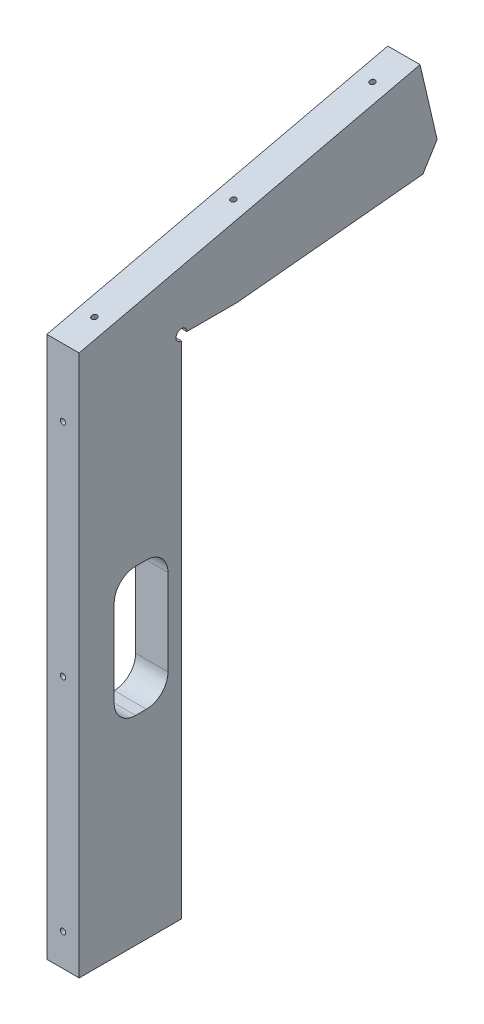
ISO-10303-21;
HEADER;
FILE_DESCRIPTION(('STEP AP214'),'2;1');
FILE_NAME('part.step','',(''),(''),'','','');
FILE_SCHEMA(('AUTOMOTIVE_DESIGN { 1 0 10303 214 1 1 1 1 }'));
ENDSEC;
DATA;
#1=APPLICATION_CONTEXT('core data for automotive mechanical design processes');
#2=APPLICATION_PROTOCOL_DEFINITION('international standard','automotive_design',2000,#1);
#3=PRODUCT_CONTEXT('',#1,'mechanical');
#4=PRODUCT('Part','Part','',(#3));
#5=PRODUCT_RELATED_PRODUCT_CATEGORY('part','',(#4));
#6=PRODUCT_DEFINITION_FORMATION('','',#4);
#7=PRODUCT_DEFINITION_CONTEXT('part definition',#1,'design');
#8=PRODUCT_DEFINITION('design','',#6,#7);
#9=PRODUCT_DEFINITION_SHAPE('','',#8);
#10=(LENGTH_UNIT() NAMED_UNIT(*) SI_UNIT(.MILLI.,.METRE.));
#11=(NAMED_UNIT(*) PLANE_ANGLE_UNIT() SI_UNIT($,.RADIAN.));
#12=(NAMED_UNIT(*) SI_UNIT($,.STERADIAN.) SOLID_ANGLE_UNIT());
#13=UNCERTAINTY_MEASURE_WITH_UNIT(LENGTH_MEASURE(1.E-05),#10,'distance_accuracy_value','');
#14=(GEOMETRIC_REPRESENTATION_CONTEXT(3) GLOBAL_UNCERTAINTY_ASSIGNED_CONTEXT((#13)) GLOBAL_UNIT_ASSIGNED_CONTEXT((#10,
#11,#12)) REPRESENTATION_CONTEXT('',''));
#15=CARTESIAN_POINT('',(0.,0.,0.));
#16=DIRECTION('',(0.,0.,1.));
#17=DIRECTION('',(1.,0.,0.));
#18=AXIS2_PLACEMENT_3D('',#15,#16,#17);
#19=CARTESIAN_POINT('',(-94.738766336441,-298.45,0.));
#20=DIRECTION('',(0.,0.,-1.));
#21=DIRECTION('',(0.,-1.,0.));
#22=AXIS2_PLACEMENT_3D('',#19,#20,#21);
#23=PLANE('',#22);
#24=CARTESIAN_POINT('',(-104.263766336441,-19.0499999999982,0.));
#25=DIRECTION('',(0.,0.,1.));
#26=DIRECTION('',(0.,-1.,0.));
#27=AXIS2_PLACEMENT_3D('',#24,#25,#26);
#28=CIRCLE('',#27,1.58750000000001);
#29=CARTESIAN_POINT('',(-104.263766336441,-20.6374999999982,0.));
#30=VERTEX_POINT('',#29);
#31=EDGE_CURVE('E182',#30,#30,#28,.T.);
#32=ORIENTED_EDGE('',*,*,#31,.F.);
#33=EDGE_LOOP('',(#32));
#34=FACE_BOUND('',#33,.T.);
#35=CARTESIAN_POINT('',(-104.263766336441,-149.224999999999,0.));
#36=DIRECTION('',(0.,0.,1.));
#37=DIRECTION('',(0.,-1.,0.));
#38=AXIS2_PLACEMENT_3D('',#35,#36,#37);
#39=CIRCLE('',#38,1.58750000000001);
#40=CARTESIAN_POINT('',(-104.263766336441,-150.812499999999,0.));
#41=VERTEX_POINT('',#40);
#42=EDGE_CURVE('E197',#41,#41,#39,.T.);
#43=ORIENTED_EDGE('',*,*,#42,.F.);
#44=EDGE_LOOP('',(#43));
#45=FACE_BOUND('',#44,.T.);
#46=CARTESIAN_POINT('',(-104.263766336441,-279.4,0.));
#47=DIRECTION('',(0.,0.,1.));
#48=DIRECTION('',(0.,-1.,0.));
#49=AXIS2_PLACEMENT_3D('',#46,#47,#48);
#50=CIRCLE('',#49,1.58750000000001);
#51=CARTESIAN_POINT('',(-104.263766336441,-280.9875,0.));
#52=VERTEX_POINT('',#51);
#53=EDGE_CURVE('E201',#52,#52,#50,.T.);
#54=ORIENTED_EDGE('',*,*,#53,.F.);
#55=EDGE_LOOP('',(#54));
#56=FACE_BOUND('',#55,.T.);
#57=DIRECTION('',(0.,1.,0.));
#58=VECTOR('',#57,1.);
#59=CARTESIAN_POINT('',(-113.788766336441,-298.45,0.));
#60=LINE('',#59,#58);
#61=CARTESIAN_POINT('',(-113.788766336441,-298.45,0.));
#62=VERTEX_POINT('',#61);
#63=CARTESIAN_POINT('',(-113.788766336441,20.8246330030021,0.));
#64=VERTEX_POINT('',#63);
#65=EDGE_CURVE('E227',#62,#64,#60,.T.);
#66=ORIENTED_EDGE('',*,*,#65,.F.);
#67=DIRECTION('',(-1.,0.,0.));
#68=VECTOR('',#67,1.);
#69=CARTESIAN_POINT('',(-94.738766336441,-298.45,0.));
#70=LINE('',#69,#68);
#71=CARTESIAN_POINT('',(-94.738766336441,-298.45,0.));
#72=VERTEX_POINT('',#71);
#73=EDGE_CURVE('E246',#72,#62,#70,.T.);
#74=ORIENTED_EDGE('',*,*,#73,.F.);
#75=DIRECTION('',(0.,1.,0.));
#76=VECTOR('',#75,1.);
#77=CARTESIAN_POINT('',(-94.738766336441,-298.45,0.));
#78=LINE('',#77,#76);
#79=CARTESIAN_POINT('',(-94.738766336441,20.8246330030021,0.));
#80=VERTEX_POINT('',#79);
#81=EDGE_CURVE('E228',#72,#80,#78,.T.);
#82=ORIENTED_EDGE('',*,*,#81,.T.);
#83=DIRECTION('',(-1.,0.,0.));
#84=VECTOR('',#83,1.);
#85=CARTESIAN_POINT('',(-94.738766336441,20.8246330030021,0.));
#86=LINE('',#85,#84);
#87=EDGE_CURVE('E276',#80,#64,#86,.T.);
#88=ORIENTED_EDGE('',*,*,#87,.T.);
#89=EDGE_LOOP('',(#66,#74,#82,#88));
#90=FACE_BOUND('',#89,.T.);
#91=ADVANCED_FACE('F37',(#34,#45,#56,#90),#23,.F.);
#92=CARTESIAN_POINT('',(-94.738766336441,20.8246330030021,0.));
#93=DIRECTION('',(0.,-0.974040610761285,-0.22637333895091));
#94=DIRECTION('',(0.,-0.22637333895091,0.974040610761285));
#95=AXIS2_PLACEMENT_3D('',#92,#93,#94);
#96=PLANE('',#95);
#97=CARTESIAN_POINT('',(-104.263766336441,63.2458327421274,-182.530202075097));
#98=DIRECTION('',(0.,0.974040610761285,0.22637333895091));
#99=DIRECTION('',(0.,-0.22637333895091,0.974040610761285));
#100=AXIS2_PLACEMENT_3D('',#97,#98,#99);
#101=CIRCLE('',#100,1.58750000000001);
#102=CARTESIAN_POINT('',(-104.263766336441,62.8864650665428,-180.983912605514));
#103=VERTEX_POINT('',#102);
#104=EDGE_CURVE('E205',#103,#103,#101,.T.);
#105=ORIENTED_EDGE('',*,*,#104,.F.);
#106=EDGE_LOOP('',(#105));
#107=FACE_BOUND('',#106,.T.);
#108=CARTESIAN_POINT('',(-104.263766336441,44.1914389260722,-100.54283785505));
#109=DIRECTION('',(0.,0.974040610761285,0.22637333895091));
#110=DIRECTION('',(0.,-0.22637333895091,0.974040610761285));
#111=AXIS2_PLACEMENT_3D('',#108,#109,#110);
#112=CIRCLE('',#111,1.58750000000001);
#113=CARTESIAN_POINT('',(-104.263766336441,43.8320712504876,-98.9965483854664));
#114=VERTEX_POINT('',#113);
#115=EDGE_CURVE('E209',#114,#114,#112,.T.);
#116=ORIENTED_EDGE('',*,*,#115,.F.);
#117=EDGE_LOOP('',(#116));
#118=FACE_BOUND('',#117,.T.);
#119=CARTESIAN_POINT('',(-104.263766336441,25.137045110017,-18.5554736350028));
#120=DIRECTION('',(0.,0.974040610761285,0.22637333895091));
#121=DIRECTION('',(0.,-0.22637333895091,0.974040610761285));
#122=AXIS2_PLACEMENT_3D('',#119,#120,#121);
#123=CIRCLE('',#122,1.58750000000001);
#124=CARTESIAN_POINT('',(-104.263766336441,24.7776774344324,-17.0091841654192));
#125=VERTEX_POINT('',#124);
#126=EDGE_CURVE('E213',#125,#125,#123,.T.);
#127=ORIENTED_EDGE('',*,*,#126,.F.);
#128=EDGE_LOOP('',(#127));
#129=FACE_BOUND('',#128,.T.);
#130=DIRECTION('',(0.,0.22637333895091,-0.974040610761284));
#131=VECTOR('',#130,1.);
#132=CARTESIAN_POINT('',(-113.788766336441,20.8246330030021,0.));
#133=LINE('',#132,#131);
#134=CARTESIAN_POINT('',(-113.788766336441,67.5582448491421,-201.0856757101));
#135=VERTEX_POINT('',#134);
#136=EDGE_CURVE('E249',#64,#135,#133,.T.);
#137=ORIENTED_EDGE('',*,*,#136,.F.);
#138=ORIENTED_EDGE('',*,*,#87,.F.);
#139=DIRECTION('',(0.,0.22637333895091,-0.974040610761284));
#140=VECTOR('',#139,1.);
#141=CARTESIAN_POINT('',(-94.738766336441,20.8246330030021,0.));
#142=LINE('',#141,#140);
#143=CARTESIAN_POINT('',(-94.738766336441,67.5582448491421,-201.0856757101));
#144=VERTEX_POINT('',#143);
#145=EDGE_CURVE('E231',#80,#144,#142,.T.);
#146=ORIENTED_EDGE('',*,*,#145,.T.);
#147=DIRECTION('',(-1.,0.,0.));
#148=VECTOR('',#147,1.);
#149=CARTESIAN_POINT('',(-94.738766336441,67.5582448491421,-201.0856757101));
#150=LINE('',#149,#148);
#151=EDGE_CURVE('E220',#144,#135,#150,.T.);
#152=ORIENTED_EDGE('',*,*,#151,.T.);
#153=EDGE_LOOP('',(#137,#138,#146,#152));
#154=FACE_BOUND('',#153,.T.);
#155=ADVANCED_FACE('F386',(#107,#118,#129,#154),#96,.F.);
#156=CARTESIAN_POINT('',(-94.738766336441,0.,-93.1961939808879));
#157=DIRECTION('',(0.,1.,0.));
#158=DIRECTION('',(0.,0.,-1.));
#159=AXIS2_PLACEMENT_3D('',#156,#157,#158);
#160=PLANE('',#159);
#161=DIRECTION('',(0.,0.,1.));
#162=VECTOR('',#161,1.);
#163=CARTESIAN_POINT('',(-113.788766336441,0.,-93.1961939808879));
#164=LINE('',#163,#162);
#165=CARTESIAN_POINT('',(-113.788766336441,0.,-93.1961939808879));
#166=VERTEX_POINT('',#165);
#167=CARTESIAN_POINT('',(-113.788766336441,8.23729306522208E-13,-63.5));
#168=VERTEX_POINT('',#167);
#169=EDGE_CURVE('E252',#166,#168,#164,.T.);
#170=ORIENTED_EDGE('',*,*,#169,.F.);
#171=DIRECTION('',(-1.,0.,0.));
#172=VECTOR('',#171,1.);
#173=CARTESIAN_POINT('',(-94.738766336441,0.,-93.1961939808879));
#174=LINE('',#173,#172);
#175=CARTESIAN_POINT('',(-94.738766336441,0.,-93.1961939808879));
#176=VERTEX_POINT('',#175);
#177=EDGE_CURVE('E273',#176,#166,#174,.T.);
#178=ORIENTED_EDGE('',*,*,#177,.F.);
#179=DIRECTION('',(0.,0.,1.));
#180=VECTOR('',#179,1.);
#181=CARTESIAN_POINT('',(-94.738766336441,0.,-93.1961939808879));
#182=LINE('',#181,#180);
#183=CARTESIAN_POINT('',(-94.738766336441,8.23729306522208E-13,-63.5));
#184=VERTEX_POINT('',#183);
#185=EDGE_CURVE('E235',#176,#184,#182,.T.);
#186=ORIENTED_EDGE('',*,*,#185,.T.);
#187=DIRECTION('',(-1.,0.,0.));
#188=VECTOR('',#187,1.);
#189=CARTESIAN_POINT('',(-94.738766336441,8.23729306522208E-13,-63.5));
#190=LINE('',#189,#188);
#191=EDGE_CURVE('E270',#184,#168,#190,.T.);
#192=ORIENTED_EDGE('',*,*,#191,.T.);
#193=EDGE_LOOP('',(#170,#178,#186,#192));
#194=FACE_BOUND('',#193,.T.);
#195=ADVANCED_FACE('F392',(#194),#160,.F.);
#196=CARTESIAN_POINT('',(-94.738766336441,0.,-60.325));
#197=DIRECTION('',(-1.,0.,0.));
#198=DIRECTION('',(0.,0.,-1.));
#199=AXIS2_PLACEMENT_3D('',#196,#197,#198);
#200=CYLINDRICAL_SURFACE('',#199,3.17499999999999);
#201=CARTESIAN_POINT('',(-113.788766336441,0.,-60.325));
#202=DIRECTION('',(1.,0.,0.));
#203=DIRECTION('',(0.,0.,1.));
#204=AXIS2_PLACEMENT_3D('',#201,#202,#203);
#205=CIRCLE('',#204,3.17499999999999);
#206=CARTESIAN_POINT('',(-113.788766336441,-3.17500000000002,-60.325));
#207=VERTEX_POINT('',#206);
#208=EDGE_CURVE('E255',#168,#207,#205,.T.);
#209=ORIENTED_EDGE('',*,*,#208,.F.);
#210=ORIENTED_EDGE('',*,*,#191,.F.);
#211=CARTESIAN_POINT('',(-94.738766336441,0.,-60.325));
#212=DIRECTION('',(1.,0.,0.));
#213=DIRECTION('',(0.,0.,1.));
#214=AXIS2_PLACEMENT_3D('',#211,#212,#213);
#215=CIRCLE('',#214,3.17499999999999);
#216=CARTESIAN_POINT('',(-94.738766336441,-3.17500000000002,-60.325));
#217=VERTEX_POINT('',#216);
#218=EDGE_CURVE('E238',#184,#217,#215,.T.);
#219=ORIENTED_EDGE('',*,*,#218,.T.);
#220=DIRECTION('',(-1.,0.,0.));
#221=VECTOR('',#220,1.);
#222=CARTESIAN_POINT('',(-94.738766336441,-3.17500000000002,-60.325));
#223=LINE('',#222,#221);
#224=EDGE_CURVE('E267',#217,#207,#223,.T.);
#225=ORIENTED_EDGE('',*,*,#224,.T.);
#226=EDGE_LOOP('',(#209,#210,#219,#225));
#227=FACE_BOUND('',#226,.T.);
#228=ADVANCED_FACE('F437',(#227),#200,.F.);
#229=CARTESIAN_POINT('',(-94.738766336441,-3.17500000000002,-60.325));
#230=DIRECTION('',(0.,0.,1.));
#231=DIRECTION('',(-1.,0.,0.));
#232=AXIS2_PLACEMENT_3D('',#229,#230,#231);
#233=PLANE('',#232);
#234=DIRECTION('',(0.,-1.,0.));
#235=VECTOR('',#234,1.);
#236=CARTESIAN_POINT('',(-113.788766336441,-3.17500000000002,-60.325));
#237=LINE('',#236,#235);
#238=CARTESIAN_POINT('',(-113.788766336441,-298.45,-60.325));
#239=VERTEX_POINT('',#238);
#240=EDGE_CURVE('E258',#207,#239,#237,.T.);
#241=ORIENTED_EDGE('',*,*,#240,.F.);
#242=ORIENTED_EDGE('',*,*,#224,.F.);
#243=DIRECTION('',(0.,-1.,0.));
#244=VECTOR('',#243,1.);
#245=CARTESIAN_POINT('',(-94.738766336441,-3.17500000000002,-60.325));
#246=LINE('',#245,#244);
#247=CARTESIAN_POINT('',(-94.738766336441,-298.45,-60.325));
#248=VERTEX_POINT('',#247);
#249=EDGE_CURVE('E241',#217,#248,#246,.T.);
#250=ORIENTED_EDGE('',*,*,#249,.T.);
#251=DIRECTION('',(-1.,0.,0.));
#252=VECTOR('',#251,1.);
#253=CARTESIAN_POINT('',(-94.738766336441,-298.45,-60.325));
#254=LINE('',#253,#252);
#255=EDGE_CURVE('E264',#248,#239,#254,.T.);
#256=ORIENTED_EDGE('',*,*,#255,.T.);
#257=EDGE_LOOP('',(#241,#242,#250,#256));
#258=FACE_BOUND('',#257,.T.);
#259=ADVANCED_FACE('F434',(#258),#233,.F.);
#260=CARTESIAN_POINT('',(-94.738766336441,-298.45,0.));
#261=DIRECTION('',(0.,1.,0.));
#262=DIRECTION('',(0.,0.,-1.));
#263=AXIS2_PLACEMENT_3D('',#260,#261,#262);
#264=PLANE('',#263);
#265=DIRECTION('',(0.,0.,1.));
#266=VECTOR('',#265,1.);
#267=CARTESIAN_POINT('',(-113.788766336441,-298.45,0.));
#268=LINE('',#267,#266);
#269=EDGE_CURVE('E232',#239,#62,#268,.T.);
#270=ORIENTED_EDGE('',*,*,#269,.F.);
#271=ORIENTED_EDGE('',*,*,#255,.F.);
#272=DIRECTION('',(0.,0.,1.));
#273=VECTOR('',#272,1.);
#274=CARTESIAN_POINT('',(-94.738766336441,-298.45,0.));
#275=LINE('',#274,#273);
#276=EDGE_CURVE('E244',#248,#72,#275,.T.);
#277=ORIENTED_EDGE('',*,*,#276,.T.);
#278=ORIENTED_EDGE('',*,*,#73,.T.);
#279=EDGE_LOOP('',(#270,#271,#277,#278));
#280=FACE_BOUND('',#279,.T.);
#281=ADVANCED_FACE('F431',(#280),#264,.F.);
#282=CARTESIAN_POINT('',(-94.738766336441,0.,-60.325));
#283=DIRECTION('',(1.,0.,0.));
#284=DIRECTION('',(0.,0.,1.));
#285=AXIS2_PLACEMENT_3D('',#282,#283,#284);
#286=PLANE('',#285);
#287=DIRECTION('',(0.,1.,0.));
#288=VECTOR('',#287,1.);
#289=CARTESIAN_POINT('',(-94.738766336441,-180.975,-20.6375));
#290=LINE('',#289,#288);
#291=CARTESIAN_POINT('',(-94.738766336441,-168.275,-20.6375));
#292=VERTEX_POINT('',#291);
#293=CARTESIAN_POINT('',(-94.738766336441,-117.475,-20.6375));
#294=VERTEX_POINT('',#293);
#295=EDGE_CURVE('E335',#292,#294,#290,.T.);
#296=ORIENTED_EDGE('',*,*,#295,.T.);
#297=CARTESIAN_POINT('',(-94.738766336441,-117.475,-33.3375));
#298=DIRECTION('',(-1.,0.,0.));
#299=DIRECTION('',(0.,0.,1.));
#300=AXIS2_PLACEMENT_3D('',#297,#298,#299);
#301=CIRCLE('',#300,12.7);
#302=CARTESIAN_POINT('',(-94.738766336441,-104.775,-33.3375));
#303=VERTEX_POINT('',#302);
#304=EDGE_CURVE('E45',#303,#294,#301,.F.);
#305=ORIENTED_EDGE('',*,*,#304,.F.);
#306=DIRECTION('',(0.,0.,-1.));
#307=VECTOR('',#306,1.);
#308=CARTESIAN_POINT('',(-94.738766336441,-104.775,-52.3875));
#309=LINE('',#308,#307);
#310=CARTESIAN_POINT('',(-94.738766336441,-104.775,-39.6875));
#311=VERTEX_POINT('',#310);
#312=EDGE_CURVE('E339',#303,#311,#309,.T.);
#313=ORIENTED_EDGE('',*,*,#312,.T.);
#314=CARTESIAN_POINT('',(-94.738766336441,-117.475,-39.6875));
#315=DIRECTION('',(-1.,0.,0.));
#316=DIRECTION('',(0.,0.,1.));
#317=AXIS2_PLACEMENT_3D('',#314,#315,#316);
#318=CIRCLE('',#317,12.7);
#319=CARTESIAN_POINT('',(-94.738766336441,-117.475,-52.3875));
#320=VERTEX_POINT('',#319);
#321=EDGE_CURVE('E319',#320,#311,#318,.F.);
#322=ORIENTED_EDGE('',*,*,#321,.F.);
#323=DIRECTION('',(0.,-1.,0.));
#324=VECTOR('',#323,1.);
#325=CARTESIAN_POINT('',(-94.738766336441,-180.975,-52.3875));
#326=LINE('',#325,#324);
#327=CARTESIAN_POINT('',(-94.738766336441,-168.275,-52.3875));
#328=VERTEX_POINT('',#327);
#329=EDGE_CURVE('E341',#320,#328,#326,.T.);
#330=ORIENTED_EDGE('',*,*,#329,.T.);
#331=CARTESIAN_POINT('',(-94.738766336441,-168.275,-39.6875));
#332=DIRECTION('',(-1.,0.,0.));
#333=DIRECTION('',(0.,0.,1.));
#334=AXIS2_PLACEMENT_3D('',#331,#332,#333);
#335=CIRCLE('',#334,12.7);
#336=CARTESIAN_POINT('',(-94.738766336441,-180.975,-39.6875));
#337=VERTEX_POINT('',#336);
#338=EDGE_CURVE('E313',#337,#328,#335,.F.);
#339=ORIENTED_EDGE('',*,*,#338,.F.);
#340=DIRECTION('',(0.,0.,1.));
#341=VECTOR('',#340,1.);
#342=CARTESIAN_POINT('',(-94.738766336441,-180.975,-52.3875));
#343=LINE('',#342,#341);
#344=CARTESIAN_POINT('',(-94.738766336441,-180.975,-33.3375));
#345=VERTEX_POINT('',#344);
#346=EDGE_CURVE('E193',#337,#345,#343,.T.);
#347=ORIENTED_EDGE('',*,*,#346,.T.);
#348=CARTESIAN_POINT('',(-94.738766336441,-168.275,-33.3375));
#349=DIRECTION('',(-1.,0.,0.));
#350=DIRECTION('',(0.,0.,1.));
#351=AXIS2_PLACEMENT_3D('',#348,#349,#350);
#352=CIRCLE('',#351,12.7);
#353=EDGE_CURVE('E325',#292,#345,#352,.F.);
#354=ORIENTED_EDGE('',*,*,#353,.F.);
#355=EDGE_LOOP('',(#296,#305,#313,#322,#330,#339,#347,#354));
#356=FACE_BOUND('',#355,.T.);
#357=DIRECTION('',(0.,0.974040610761284,0.226373338950911));
#358=VECTOR('',#357,1.);
#359=CARTESIAN_POINT('',(-94.738766336441,67.5582448491421,-201.0856757101));
#360=LINE('',#359,#358);
#361=CARTESIAN_POINT('',(-94.738766336441,24.2621397008031,-211.147970626468));
#362=VERTEX_POINT('',#361);
#363=EDGE_CURVE('E217',#362,#144,#360,.T.);
#364=ORIENTED_EDGE('',*,*,#363,.T.);
#365=ORIENTED_EDGE('',*,*,#145,.F.);
#366=ORIENTED_EDGE('',*,*,#81,.F.);
#367=ORIENTED_EDGE('',*,*,#276,.F.);
#368=ORIENTED_EDGE('',*,*,#249,.F.);
#369=ORIENTED_EDGE('',*,*,#218,.F.);
#370=ORIENTED_EDGE('',*,*,#185,.F.);
#371=DIRECTION('',(0.,0.0979472387782762,-0.995191608895348));
#372=VECTOR('',#371,1.);
#373=CARTESIAN_POINT('',(-94.738766336441,0.,-93.19619398089));
#374=LINE('',#373,#372);
#375=CARTESIAN_POINT('',(-94.738766336441,10.7825686375829,-202.752338332767));
#376=VERTEX_POINT('',#375);
#377=EDGE_CURVE('E214',#176,#376,#374,.T.);
#378=ORIENTED_EDGE('',*,*,#377,.T.);
#379=DIRECTION('',(0.,0.848820844072422,-0.528680597968359));
#380=VECTOR('',#379,1.);
#381=CARTESIAN_POINT('',(-94.738766336441,-60.9012339163843,-158.104712318951));
#382=LINE('',#381,#380);
#383=EDGE_CURVE('E286',#362,#376,#382,.F.);
#384=ORIENTED_EDGE('',*,*,#383,.F.);
#385=EDGE_LOOP('',(#364,#365,#366,#367,#368,#369,#370,#378,#384));
#386=FACE_BOUND('',#385,.T.);
#387=ADVANCED_FACE('F336',(#356,#386),#286,.T.);
#388=CARTESIAN_POINT('',(-113.788766336441,0.,-60.325));
#389=DIRECTION('',(1.,0.,0.));
#390=DIRECTION('',(0.,0.,1.));
#391=AXIS2_PLACEMENT_3D('',#388,#389,#390);
#392=PLANE('',#391);
#393=DIRECTION('',(0.,-1.,0.));
#394=VECTOR('',#393,1.);
#395=CARTESIAN_POINT('',(-113.788766336441,-180.975,-52.3875));
#396=LINE('',#395,#394);
#397=CARTESIAN_POINT('',(-113.788766336441,-117.475,-52.3875));
#398=VERTEX_POINT('',#397);
#399=CARTESIAN_POINT('',(-113.788766336441,-168.275,-52.3875));
#400=VERTEX_POINT('',#399);
#401=EDGE_CURVE('E189',#398,#400,#396,.T.);
#402=ORIENTED_EDGE('',*,*,#401,.F.);
#403=CARTESIAN_POINT('',(-113.788766336441,-117.475,-39.6875));
#404=DIRECTION('',(-1.,0.,0.));
#405=DIRECTION('',(0.,0.,1.));
#406=AXIS2_PLACEMENT_3D('',#403,#404,#405);
#407=CIRCLE('',#406,12.7);
#408=CARTESIAN_POINT('',(-113.788766336441,-104.775,-39.6875));
#409=VERTEX_POINT('',#408);
#410=EDGE_CURVE('E322',#409,#398,#407,.T.);
#411=ORIENTED_EDGE('',*,*,#410,.F.);
#412=DIRECTION('',(0.,0.,-1.));
#413=VECTOR('',#412,1.);
#414=CARTESIAN_POINT('',(-113.788766336441,-104.775,-52.3875));
#415=LINE('',#414,#413);
#416=CARTESIAN_POINT('',(-113.788766336441,-104.775,-33.3375));
#417=VERTEX_POINT('',#416);
#418=EDGE_CURVE('E350',#417,#409,#415,.T.);
#419=ORIENTED_EDGE('',*,*,#418,.F.);
#420=CARTESIAN_POINT('',(-113.788766336441,-117.475,-33.3375));
#421=DIRECTION('',(-1.,0.,0.));
#422=DIRECTION('',(0.,0.,1.));
#423=AXIS2_PLACEMENT_3D('',#420,#421,#422);
#424=CIRCLE('',#423,12.7);
#425=CARTESIAN_POINT('',(-113.788766336441,-117.475,-20.6375));
#426=VERTEX_POINT('',#425);
#427=EDGE_CURVE('E11',#426,#417,#424,.T.);
#428=ORIENTED_EDGE('',*,*,#427,.F.);
#429=DIRECTION('',(0.,1.,0.));
#430=VECTOR('',#429,1.);
#431=CARTESIAN_POINT('',(-113.788766336441,-180.975,-20.6375));
#432=LINE('',#431,#430);
#433=CARTESIAN_POINT('',(-113.788766336441,-168.275,-20.6375));
#434=VERTEX_POINT('',#433);
#435=EDGE_CURVE('E348',#434,#426,#432,.T.);
#436=ORIENTED_EDGE('',*,*,#435,.F.);
#437=CARTESIAN_POINT('',(-113.788766336441,-168.275,-33.3375));
#438=DIRECTION('',(-1.,0.,0.));
#439=DIRECTION('',(0.,0.,1.));
#440=AXIS2_PLACEMENT_3D('',#437,#438,#439);
#441=CIRCLE('',#440,12.7);
#442=CARTESIAN_POINT('',(-113.788766336441,-180.975,-33.3375));
#443=VERTEX_POINT('',#442);
#444=EDGE_CURVE('E328',#443,#434,#441,.T.);
#445=ORIENTED_EDGE('',*,*,#444,.F.);
#446=DIRECTION('',(0.,0.,1.));
#447=VECTOR('',#446,1.);
#448=CARTESIAN_POINT('',(-113.788766336441,-180.975,-52.3875));
#449=LINE('',#448,#447);
#450=CARTESIAN_POINT('',(-113.788766336441,-180.975,-39.6875));
#451=VERTEX_POINT('',#450);
#452=EDGE_CURVE('E183',#451,#443,#449,.T.);
#453=ORIENTED_EDGE('',*,*,#452,.F.);
#454=CARTESIAN_POINT('',(-113.788766336441,-168.275,-39.6875));
#455=DIRECTION('',(-1.,0.,0.));
#456=DIRECTION('',(0.,0.,1.));
#457=AXIS2_PLACEMENT_3D('',#454,#455,#456);
#458=CIRCLE('',#457,12.7);
#459=EDGE_CURVE('E316',#400,#451,#458,.T.);
#460=ORIENTED_EDGE('',*,*,#459,.F.);
#461=EDGE_LOOP('',(#402,#411,#419,#428,#436,#445,#453,#460));
#462=FACE_BOUND('',#461,.T.);
#463=DIRECTION('',(0.,0.0979472387782762,-0.995191608895348));
#464=VECTOR('',#463,1.);
#465=CARTESIAN_POINT('',(-113.788766336441,0.,-93.19619398089));
#466=LINE('',#465,#464);
#467=CARTESIAN_POINT('',(-113.788766336441,10.7825686375829,-202.752338332767));
#468=VERTEX_POINT('',#467);
#469=EDGE_CURVE('E221',#166,#468,#466,.T.);
#470=ORIENTED_EDGE('',*,*,#469,.F.);
#471=ORIENTED_EDGE('',*,*,#169,.T.);
#472=ORIENTED_EDGE('',*,*,#208,.T.);
#473=ORIENTED_EDGE('',*,*,#240,.T.);
#474=ORIENTED_EDGE('',*,*,#269,.T.);
#475=ORIENTED_EDGE('',*,*,#65,.T.);
#476=ORIENTED_EDGE('',*,*,#136,.T.);
#477=DIRECTION('',(0.,0.974040610761284,0.226373338950911));
#478=VECTOR('',#477,1.);
#479=CARTESIAN_POINT('',(-113.788766336441,67.5582448491421,-201.0856757101));
#480=LINE('',#479,#478);
#481=CARTESIAN_POINT('',(-113.788766336441,24.2621397008031,-211.147970626468));
#482=VERTEX_POINT('',#481);
#483=EDGE_CURVE('E218',#482,#135,#480,.T.);
#484=ORIENTED_EDGE('',*,*,#483,.F.);
#485=DIRECTION('',(0.,-0.848820844072422,0.528680597968359));
#486=VECTOR('',#485,1.);
#487=CARTESIAN_POINT('',(-113.788766336441,10.7825686375829,-202.752338332767));
#488=LINE('',#487,#486);
#489=EDGE_CURVE('E281',#468,#482,#488,.F.);
#490=ORIENTED_EDGE('',*,*,#489,.F.);
#491=EDGE_LOOP('',(#470,#471,#472,#473,#474,#475,#476,#484,#490));
#492=FACE_BOUND('',#491,.T.);
#493=ADVANCED_FACE('F363',(#462,#492),#392,.F.);
#494=CARTESIAN_POINT('',(-94.738766336441,67.5582448491421,-201.0856757101));
#495=DIRECTION('',(0.,0.226373338950911,-0.974040610761284));
#496=DIRECTION('',(0.,-0.974040610761284,-0.226373338950911));
#497=AXIS2_PLACEMENT_3D('',#494,#495,#496);
#498=PLANE('',#497);
#499=ORIENTED_EDGE('',*,*,#483,.T.);
#500=ORIENTED_EDGE('',*,*,#151,.F.);
#501=ORIENTED_EDGE('',*,*,#363,.F.);
#502=DIRECTION('',(1.,0.,0.));
#503=VECTOR('',#502,1.);
#504=CARTESIAN_POINT('',(-94.738766336441,24.2621397008031,-211.147970626468));
#505=LINE('',#504,#503);
#506=EDGE_CURVE('E284',#482,#362,#505,.T.);
#507=ORIENTED_EDGE('',*,*,#506,.F.);
#508=EDGE_LOOP('',(#499,#500,#501,#507));
#509=FACE_BOUND('',#508,.T.);
#510=ADVANCED_FACE('F411',(#509),#498,.T.);
#511=CARTESIAN_POINT('',(-94.738766336441,0.,-93.19619398089));
#512=DIRECTION('',(0.,-0.995191608895348,-0.0979472387782762));
#513=DIRECTION('',(0.,-0.0979472387782762,0.995191608895348));
#514=AXIS2_PLACEMENT_3D('',#511,#512,#513);
#515=PLANE('',#514);
#516=ORIENTED_EDGE('',*,*,#377,.F.);
#517=ORIENTED_EDGE('',*,*,#177,.T.);
#518=ORIENTED_EDGE('',*,*,#469,.T.);
#519=DIRECTION('',(-1.,0.,0.));
#520=VECTOR('',#519,1.);
#521=CARTESIAN_POINT('',(-94.738766336441,10.7825686375829,-202.752338332767));
#522=LINE('',#521,#520);
#523=EDGE_CURVE('E279',#376,#468,#522,.T.);
#524=ORIENTED_EDGE('',*,*,#523,.F.);
#525=EDGE_LOOP('',(#516,#517,#518,#524));
#526=FACE_BOUND('',#525,.T.);
#527=ADVANCED_FACE('F402',(#526),#515,.T.);
#528=CARTESIAN_POINT('',(-94.738766336441,10.7825686375829,-202.752338332767));
#529=DIRECTION('',(0.,0.528680597968359,0.848820844072422));
#530=DIRECTION('',(-1.,0.,0.));
#531=AXIS2_PLACEMENT_3D('',#528,#529,#530);
#532=PLANE('',#531);
#533=ORIENTED_EDGE('',*,*,#383,.T.);
#534=ORIENTED_EDGE('',*,*,#523,.T.);
#535=ORIENTED_EDGE('',*,*,#489,.T.);
#536=ORIENTED_EDGE('',*,*,#506,.T.);
#537=EDGE_LOOP('',(#533,#534,#535,#536));
#538=FACE_BOUND('',#537,.T.);
#539=ADVANCED_FACE('F399',(#538),#532,.F.);
#540=CARTESIAN_POINT('',(-104.263766336441,56.0628345016867,-11.3681201233116));
#541=DIRECTION('',(0.,0.974040610761284,0.226373338950912));
#542=DIRECTION('',(0.,0.226373338950912,-0.974040610761284));
#543=AXIS2_PLACEMENT_3D('',#540,#541,#542);
#544=CYLINDRICAL_SURFACE('',#543,1.58750000000001);
#545=CARTESIAN_POINT('',(-104.263766336441,6.58157147501348,-22.8678857420179));
#546=DIRECTION('',(0.,-0.974040610761284,-0.226373338950912));
#547=DIRECTION('',(0.,0.226373338950912,-0.974040610761284));
#548=AXIS2_PLACEMENT_3D('',#545,#546,#547);
#549=CIRCLE('',#548,1.58750000000001);
#550=CARTESIAN_POINT('',(-104.263766336441,6.94093915059806,-24.4141752116014));
#551=VERTEX_POINT('',#550);
#552=EDGE_CURVE('E210',#551,#551,#549,.T.);
#553=ORIENTED_EDGE('',*,*,#552,.T.);
#554=EDGE_LOOP('',(#553));
#555=FACE_BOUND('',#554,.T.);
#556=ORIENTED_EDGE('',*,*,#126,.T.);
#557=EDGE_LOOP('',(#556));
#558=FACE_BOUND('',#557,.T.);
#559=ADVANCED_FACE('F401',(#555,#558),#544,.F.);
#560=CARTESIAN_POINT('',(-104.263766336441,6.58157147501348,-22.8678857420179));
#561=DIRECTION('',(0.,0.974040610761284,0.226373338950912));
#562=DIRECTION('',(0.,0.226373338950912,-0.974040610761284));
#563=AXIS2_PLACEMENT_3D('',#560,#561,#562);
#564=CONICAL_SURFACE('',#563,1.58750000000001,1.02974425867665);
#565=CARTESIAN_POINT('',(-104.263766336441,5.65246702712373,-23.0838156260281));
#566=VERTEX_POINT('',#565);
#567=VERTEX_LOOP('',#566);
#568=FACE_BOUND('',#567,.T.);
#569=ORIENTED_EDGE('',*,*,#552,.F.);
#570=EDGE_LOOP('',(#569));
#571=FACE_BOUND('',#570,.T.);
#572=ADVANCED_FACE('F408',(#568,#571),#564,.F.);
#573=CARTESIAN_POINT('',(-104.263766336441,75.1172283177421,-93.3554843433587));
#574=DIRECTION('',(0.,0.974040610761284,0.226373338950912));
#575=DIRECTION('',(0.,0.226373338950912,-0.974040610761284));
#576=AXIS2_PLACEMENT_3D('',#573,#574,#575);
#577=CYLINDRICAL_SURFACE('',#576,1.58750000000001);
#578=CARTESIAN_POINT('',(-104.263766336441,25.6359652910688,-104.855249962065));
#579=DIRECTION('',(0.,-0.974040610761284,-0.226373338950912));
#580=DIRECTION('',(0.,0.226373338950912,-0.974040610761284));
#581=AXIS2_PLACEMENT_3D('',#578,#579,#580);
#582=CIRCLE('',#581,1.58750000000001);
#583=CARTESIAN_POINT('',(-104.263766336441,25.9953329666534,-106.401539431649));
#584=VERTEX_POINT('',#583);
#585=EDGE_CURVE('E206',#584,#584,#582,.T.);
#586=ORIENTED_EDGE('',*,*,#585,.T.);
#587=EDGE_LOOP('',(#586));
#588=FACE_BOUND('',#587,.T.);
#589=ORIENTED_EDGE('',*,*,#115,.T.);
#590=EDGE_LOOP('',(#589));
#591=FACE_BOUND('',#590,.T.);
#592=ADVANCED_FACE('F456',(#588,#591),#577,.F.);
#593=CARTESIAN_POINT('',(-104.263766336441,25.6359652910688,-104.855249962065));
#594=DIRECTION('',(0.,0.974040610761284,0.226373338950912));
#595=DIRECTION('',(0.,0.226373338950912,-0.974040610761284));
#596=AXIS2_PLACEMENT_3D('',#593,#594,#595);
#597=CONICAL_SURFACE('',#596,1.58750000000001,1.02974425867665);
#598=CARTESIAN_POINT('',(-104.263766336441,24.7068608431791,-105.071179846075));
#599=VERTEX_POINT('',#598);
#600=VERTEX_LOOP('',#599);
#601=FACE_BOUND('',#600,.T.);
#602=ORIENTED_EDGE('',*,*,#585,.F.);
#603=EDGE_LOOP('',(#602));
#604=FACE_BOUND('',#603,.T.);
#605=ADVANCED_FACE('F459',(#601,#604),#597,.F.);
#606=CARTESIAN_POINT('',(-104.263766336441,94.1716221337975,-175.342848563406));
#607=DIRECTION('',(0.,0.974040610761284,0.226373338950912));
#608=DIRECTION('',(0.,0.226373338950912,-0.974040610761284));
#609=AXIS2_PLACEMENT_3D('',#606,#607,#608);
#610=CYLINDRICAL_SURFACE('',#609,1.58750000000001);
#611=CARTESIAN_POINT('',(-104.263766336441,44.6903591071242,-186.842614182112));
#612=DIRECTION('',(0.,-0.974040610761284,-0.226373338950912));
#613=DIRECTION('',(0.,0.226373338950912,-0.974040610761284));
#614=AXIS2_PLACEMENT_3D('',#611,#612,#613);
#615=CIRCLE('',#614,1.58750000000001);
#616=CARTESIAN_POINT('',(-104.263766336441,45.0497267827088,-188.388903651696));
#617=VERTEX_POINT('',#616);
#618=EDGE_CURVE('E202',#617,#617,#615,.T.);
#619=ORIENTED_EDGE('',*,*,#618,.T.);
#620=EDGE_LOOP('',(#619));
#621=FACE_BOUND('',#620,.T.);
#622=ORIENTED_EDGE('',*,*,#104,.T.);
#623=EDGE_LOOP('',(#622));
#624=FACE_BOUND('',#623,.T.);
#625=ADVANCED_FACE('F462',(#621,#624),#610,.F.);
#626=CARTESIAN_POINT('',(-104.263766336441,44.6903591071242,-186.842614182112));
#627=DIRECTION('',(0.,0.974040610761284,0.226373338950912));
#628=DIRECTION('',(0.,0.226373338950912,-0.974040610761284));
#629=AXIS2_PLACEMENT_3D('',#626,#627,#628);
#630=CONICAL_SURFACE('',#629,1.58750000000001,1.02974425867665);
#631=CARTESIAN_POINT('',(-104.263766336441,43.7612546592345,-187.058544066122));
#632=VERTEX_POINT('',#631);
#633=VERTEX_LOOP('',#632);
#634=FACE_BOUND('',#633,.T.);
#635=ORIENTED_EDGE('',*,*,#618,.F.);
#636=EDGE_LOOP('',(#635));
#637=FACE_BOUND('',#636,.T.);
#638=ADVANCED_FACE('F467',(#634,#637),#630,.F.);
#639=CARTESIAN_POINT('',(-104.263766336441,-279.4,25.4));
#640=DIRECTION('',(0.,0.,1.));
#641=DIRECTION('',(-1.,0.,0.));
#642=AXIS2_PLACEMENT_3D('',#639,#640,#641);
#643=CYLINDRICAL_SURFACE('',#642,1.58750000000001);
#644=CARTESIAN_POINT('',(-104.263766336441,-279.4,-12.7));
#645=DIRECTION('',(0.,0.,-1.));
#646=DIRECTION('',(-1.,0.,0.));
#647=AXIS2_PLACEMENT_3D('',#644,#645,#646);
#648=CIRCLE('',#647,1.58750000000001);
#649=CARTESIAN_POINT('',(-105.851266336441,-279.4,-12.7));
#650=VERTEX_POINT('',#649);
#651=EDGE_CURVE('E198',#650,#650,#648,.T.);
#652=ORIENTED_EDGE('',*,*,#651,.T.);
#653=EDGE_LOOP('',(#652));
#654=FACE_BOUND('',#653,.T.);
#655=ORIENTED_EDGE('',*,*,#53,.T.);
#656=EDGE_LOOP('',(#655));
#657=FACE_BOUND('',#656,.T.);
#658=ADVANCED_FACE('F470',(#654,#657),#643,.F.);
#659=CARTESIAN_POINT('',(-104.263766336441,-279.4,-12.7));
#660=DIRECTION('',(0.,0.,1.));
#661=DIRECTION('',(-1.,0.,0.));
#662=AXIS2_PLACEMENT_3D('',#659,#660,#661);
#663=CONICAL_SURFACE('',#662,1.58750000000001,1.02974425867666);
#664=CARTESIAN_POINT('',(-104.263766336441,-279.4,-13.6538662327062));
#665=VERTEX_POINT('',#664);
#666=VERTEX_LOOP('',#665);
#667=FACE_BOUND('',#666,.T.);
#668=ORIENTED_EDGE('',*,*,#651,.F.);
#669=EDGE_LOOP('',(#668));
#670=FACE_BOUND('',#669,.T.);
#671=ADVANCED_FACE('F475',(#667,#670),#663,.F.);
#672=CARTESIAN_POINT('',(-104.263766336441,-149.224999999999,25.4));
#673=DIRECTION('',(0.,0.,1.));
#674=DIRECTION('',(-1.,0.,0.));
#675=AXIS2_PLACEMENT_3D('',#672,#673,#674);
#676=CYLINDRICAL_SURFACE('',#675,1.58750000000001);
#677=CARTESIAN_POINT('',(-104.263766336441,-149.224999999999,-12.7));
#678=DIRECTION('',(0.,0.,-1.));
#679=DIRECTION('',(-1.,0.,0.));
#680=AXIS2_PLACEMENT_3D('',#677,#678,#679);
#681=CIRCLE('',#680,1.58750000000001);
#682=CARTESIAN_POINT('',(-105.851266336441,-149.224999999999,-12.7));
#683=VERTEX_POINT('',#682);
#684=EDGE_CURVE('E186',#683,#683,#681,.T.);
#685=ORIENTED_EDGE('',*,*,#684,.T.);
#686=EDGE_LOOP('',(#685));
#687=FACE_BOUND('',#686,.T.);
#688=ORIENTED_EDGE('',*,*,#42,.T.);
#689=EDGE_LOOP('',(#688));
#690=FACE_BOUND('',#689,.T.);
#691=ADVANCED_FACE('F478',(#687,#690),#676,.F.);
#692=CARTESIAN_POINT('',(-104.263766336441,-149.224999999999,-12.7));
#693=DIRECTION('',(0.,0.,1.));
#694=DIRECTION('',(-1.,0.,0.));
#695=AXIS2_PLACEMENT_3D('',#692,#693,#694);
#696=CONICAL_SURFACE('',#695,1.58750000000001,1.02974425867666);
#697=CARTESIAN_POINT('',(-104.263766336441,-149.224999999999,-13.6538662327062));
#698=VERTEX_POINT('',#697);
#699=VERTEX_LOOP('',#698);
#700=FACE_BOUND('',#699,.T.);
#701=ORIENTED_EDGE('',*,*,#684,.F.);
#702=EDGE_LOOP('',(#701));
#703=FACE_BOUND('',#702,.T.);
#704=ADVANCED_FACE('F483',(#700,#703),#696,.F.);
#705=CARTESIAN_POINT('',(-104.263766336441,-19.0499999999982,25.4));
#706=DIRECTION('',(0.,0.,1.));
#707=DIRECTION('',(-1.,0.,0.));
#708=AXIS2_PLACEMENT_3D('',#705,#706,#707);
#709=CYLINDRICAL_SURFACE('',#708,1.58750000000001);
#710=CARTESIAN_POINT('',(-104.263766336441,-19.0499999999982,-12.7));
#711=DIRECTION('',(0.,0.,-1.));
#712=DIRECTION('',(-1.,0.,0.));
#713=AXIS2_PLACEMENT_3D('',#710,#711,#712);
#714=CIRCLE('',#713,1.58750000000001);
#715=CARTESIAN_POINT('',(-105.851266336441,-19.0499999999982,-12.7));
#716=VERTEX_POINT('',#715);
#717=EDGE_CURVE('E180',#716,#716,#714,.T.);
#718=ORIENTED_EDGE('',*,*,#717,.T.);
#719=EDGE_LOOP('',(#718));
#720=FACE_BOUND('',#719,.T.);
#721=ORIENTED_EDGE('',*,*,#31,.T.);
#722=EDGE_LOOP('',(#721));
#723=FACE_BOUND('',#722,.T.);
#724=ADVANCED_FACE('F176',(#720,#723),#709,.F.);
#725=CARTESIAN_POINT('',(-104.263766336441,-19.0499999999982,-12.7));
#726=DIRECTION('',(0.,0.,1.));
#727=DIRECTION('',(-1.,0.,0.));
#728=AXIS2_PLACEMENT_3D('',#725,#726,#727);
#729=CONICAL_SURFACE('',#728,1.58750000000001,1.02974425867666);
#730=CARTESIAN_POINT('',(-104.263766336441,-19.0499999999982,-13.6538662327062));
#731=VERTEX_POINT('',#730);
#732=VERTEX_LOOP('',#731);
#733=FACE_BOUND('',#732,.T.);
#734=ORIENTED_EDGE('',*,*,#717,.F.);
#735=EDGE_LOOP('',(#734));
#736=FACE_BOUND('',#735,.T.);
#737=ADVANCED_FACE('F172',(#733,#736),#729,.F.);
#738=CARTESIAN_POINT('',(-113.788766336441,-180.975,-20.6375));
#739=DIRECTION('',(0.,0.,1.));
#740=DIRECTION('',(-1.,0.,0.));
#741=AXIS2_PLACEMENT_3D('',#738,#739,#740);
#742=PLANE('',#741);
#743=ORIENTED_EDGE('',*,*,#435,.T.);
#744=DIRECTION('',(1.,0.,0.));
#745=VECTOR('',#744,1.);
#746=CARTESIAN_POINT('',(-113.788766336441,-117.475,-20.6375));
#747=LINE('',#746,#745);
#748=EDGE_CURVE('E51',#294,#426,#747,.F.);
#749=ORIENTED_EDGE('',*,*,#748,.F.);
#750=ORIENTED_EDGE('',*,*,#295,.F.);
#751=DIRECTION('',(1.,0.,0.));
#752=VECTOR('',#751,1.);
#753=CARTESIAN_POINT('',(-94.738766336441,-168.275,-20.6375));
#754=LINE('',#753,#752);
#755=EDGE_CURVE('E58',#434,#292,#754,.T.);
#756=ORIENTED_EDGE('',*,*,#755,.F.);
#757=EDGE_LOOP('',(#743,#749,#750,#756));
#758=FACE_BOUND('',#757,.T.);
#759=ADVANCED_FACE('F175',(#758),#742,.F.);
#760=CARTESIAN_POINT('',(-113.788766336441,-180.975,-52.3875));
#761=DIRECTION('',(0.,-1.,0.));
#762=DIRECTION('',(0.,0.,1.));
#763=AXIS2_PLACEMENT_3D('',#760,#761,#762);
#764=PLANE('',#763);
#765=ORIENTED_EDGE('',*,*,#452,.T.);
#766=DIRECTION('',(1.,0.,0.));
#767=VECTOR('',#766,1.);
#768=CARTESIAN_POINT('',(-113.788766336441,-180.975,-33.3375));
#769=LINE('',#768,#767);
#770=EDGE_CURVE('E289',#345,#443,#769,.F.);
#771=ORIENTED_EDGE('',*,*,#770,.F.);
#772=ORIENTED_EDGE('',*,*,#346,.F.);
#773=DIRECTION('',(1.,0.,0.));
#774=VECTOR('',#773,1.);
#775=CARTESIAN_POINT('',(-94.738766336441,-180.975,-39.6875));
#776=LINE('',#775,#774);
#777=EDGE_CURVE('E301',#451,#337,#776,.T.);
#778=ORIENTED_EDGE('',*,*,#777,.F.);
#779=EDGE_LOOP('',(#765,#771,#772,#778));
#780=FACE_BOUND('',#779,.T.);
#781=ADVANCED_FACE('F371',(#780),#764,.F.);
#782=CARTESIAN_POINT('',(-113.788766336441,-180.975,-52.3875));
#783=DIRECTION('',(0.,0.,-1.));
#784=DIRECTION('',(1.,0.,0.));
#785=AXIS2_PLACEMENT_3D('',#782,#783,#784);
#786=PLANE('',#785);
#787=ORIENTED_EDGE('',*,*,#329,.F.);
#788=DIRECTION('',(1.,0.,0.));
#789=VECTOR('',#788,1.);
#790=CARTESIAN_POINT('',(-94.738766336441,-117.475,-52.3875));
#791=LINE('',#790,#789);
#792=EDGE_CURVE('E303',#398,#320,#791,.T.);
#793=ORIENTED_EDGE('',*,*,#792,.F.);
#794=ORIENTED_EDGE('',*,*,#401,.T.);
#795=DIRECTION('',(1.,0.,0.));
#796=VECTOR('',#795,1.);
#797=CARTESIAN_POINT('',(-113.788766336441,-168.275,-52.3875));
#798=LINE('',#797,#796);
#799=EDGE_CURVE('E305',#328,#400,#798,.F.);
#800=ORIENTED_EDGE('',*,*,#799,.F.);
#801=EDGE_LOOP('',(#787,#793,#794,#800));
#802=FACE_BOUND('',#801,.T.);
#803=ADVANCED_FACE('F359',(#802),#786,.F.);
#804=CARTESIAN_POINT('',(-113.788766336441,-104.775,-52.3875));
#805=DIRECTION('',(0.,1.,0.));
#806=DIRECTION('',(0.,0.,-1.));
#807=AXIS2_PLACEMENT_3D('',#804,#805,#806);
#808=PLANE('',#807);
#809=ORIENTED_EDGE('',*,*,#312,.F.);
#810=DIRECTION('',(1.,0.,0.));
#811=VECTOR('',#810,1.);
#812=CARTESIAN_POINT('',(-94.738766336441,-104.775,-33.3375));
#813=LINE('',#812,#811);
#814=EDGE_CURVE('E307',#417,#303,#813,.T.);
#815=ORIENTED_EDGE('',*,*,#814,.F.);
#816=ORIENTED_EDGE('',*,*,#418,.T.);
#817=DIRECTION('',(1.,0.,0.));
#818=VECTOR('',#817,1.);
#819=CARTESIAN_POINT('',(-113.788766336441,-104.775,-39.6875));
#820=LINE('',#819,#818);
#821=EDGE_CURVE('E309',#311,#409,#820,.F.);
#822=ORIENTED_EDGE('',*,*,#821,.F.);
#823=EDGE_LOOP('',(#809,#815,#816,#822));
#824=FACE_BOUND('',#823,.T.);
#825=ADVANCED_FACE('F375',(#824),#808,.F.);
#826=CARTESIAN_POINT('',(-113.788766336441,-168.275,-39.6875));
#827=DIRECTION('',(-1.,0.,0.));
#828=DIRECTION('',(0.,0.,-1.));
#829=AXIS2_PLACEMENT_3D('',#826,#827,#828);
#830=CYLINDRICAL_SURFACE('',#829,12.7);
#831=ORIENTED_EDGE('',*,*,#459,.T.);
#832=ORIENTED_EDGE('',*,*,#777,.T.);
#833=ORIENTED_EDGE('',*,*,#338,.T.);
#834=ORIENTED_EDGE('',*,*,#799,.T.);
#835=EDGE_LOOP('',(#831,#832,#833,#834));
#836=FACE_BOUND('',#835,.T.);
#837=ADVANCED_FACE('F369',(#836),#830,.F.);
#838=CARTESIAN_POINT('',(-113.788766336441,-117.475,-39.6875));
#839=DIRECTION('',(-1.,0.,0.));
#840=DIRECTION('',(0.,0.,-1.));
#841=AXIS2_PLACEMENT_3D('',#838,#839,#840);
#842=CYLINDRICAL_SURFACE('',#841,12.7);
#843=ORIENTED_EDGE('',*,*,#410,.T.);
#844=ORIENTED_EDGE('',*,*,#792,.T.);
#845=ORIENTED_EDGE('',*,*,#321,.T.);
#846=ORIENTED_EDGE('',*,*,#821,.T.);
#847=EDGE_LOOP('',(#843,#844,#845,#846));
#848=FACE_BOUND('',#847,.T.);
#849=ADVANCED_FACE('F377',(#848),#842,.F.);
#850=CARTESIAN_POINT('',(-113.788766336441,-168.275,-33.3375));
#851=DIRECTION('',(-1.,0.,0.));
#852=DIRECTION('',(0.,0.,-1.));
#853=AXIS2_PLACEMENT_3D('',#850,#851,#852);
#854=CYLINDRICAL_SURFACE('',#853,12.7);
#855=ORIENTED_EDGE('',*,*,#444,.T.);
#856=ORIENTED_EDGE('',*,*,#755,.T.);
#857=ORIENTED_EDGE('',*,*,#353,.T.);
#858=ORIENTED_EDGE('',*,*,#770,.T.);
#859=EDGE_LOOP('',(#855,#856,#857,#858));
#860=FACE_BOUND('',#859,.T.);
#861=ADVANCED_FACE('F373',(#860),#854,.F.);
#862=CARTESIAN_POINT('',(-113.788766336441,-117.475,-33.3375));
#863=DIRECTION('',(-1.,0.,0.));
#864=DIRECTION('',(0.,0.,-1.));
#865=AXIS2_PLACEMENT_3D('',#862,#863,#864);
#866=CYLINDRICAL_SURFACE('',#865,12.7);
#867=ORIENTED_EDGE('',*,*,#427,.T.);
#868=ORIENTED_EDGE('',*,*,#814,.T.);
#869=ORIENTED_EDGE('',*,*,#304,.T.);
#870=ORIENTED_EDGE('',*,*,#748,.T.);
#871=EDGE_LOOP('',(#867,#868,#869,#870));
#872=FACE_BOUND('',#871,.T.);
#873=ADVANCED_FACE('F39',(#872),#866,.F.);
#874=CLOSED_SHELL('',(#91,#155,#195,#228,#259,#281,#387,#493,#510,#527,#539,#559,#572,#592,#605,
#625,#638,#658,#671,#691,#704,#724,#737,#759,#781,#803,#825,#837,#849,#861,#873));
#875=MANIFOLD_SOLID_BREP('B2',#874);
#876=ADVANCED_BREP_SHAPE_REPRESENTATION('',(#18,#875),#14);
#877=SHAPE_DEFINITION_REPRESENTATION(#9,#876);
ENDSEC;
END-ISO-10303-21;
